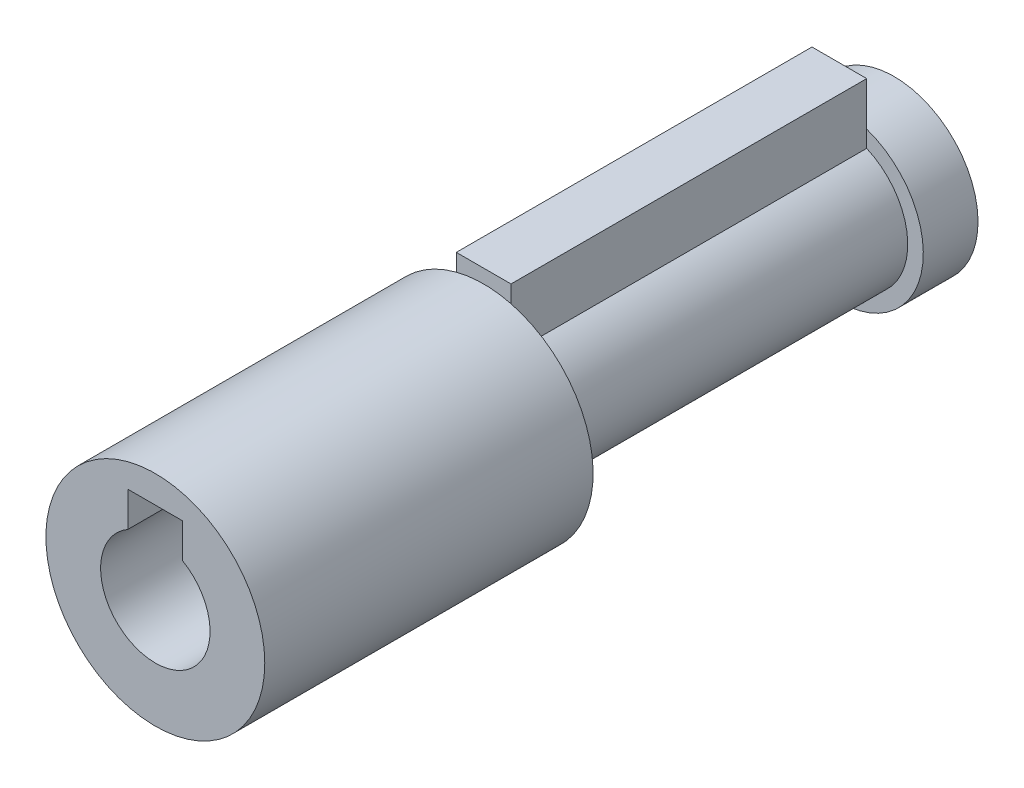
ISO-10303-21;
HEADER;
FILE_DESCRIPTION(('STEP AP214'),'2;1');
FILE_NAME('part.step','',(''),(''),'','','');
FILE_SCHEMA(('AUTOMOTIVE_DESIGN { 1 0 10303 214 1 1 1 1 }'));
ENDSEC;
DATA;
#1=APPLICATION_CONTEXT('core data for automotive mechanical design processes');
#2=APPLICATION_PROTOCOL_DEFINITION('international standard','automotive_design',2000,#1);
#3=PRODUCT_CONTEXT('',#1,'mechanical');
#4=PRODUCT('Part','Part','',(#3));
#5=PRODUCT_RELATED_PRODUCT_CATEGORY('part','',(#4));
#6=PRODUCT_DEFINITION_FORMATION('','',#4);
#7=PRODUCT_DEFINITION_CONTEXT('part definition',#1,'design');
#8=PRODUCT_DEFINITION('design','',#6,#7);
#9=PRODUCT_DEFINITION_SHAPE('','',#8);
#10=(LENGTH_UNIT() NAMED_UNIT(*) SI_UNIT(.MILLI.,.METRE.));
#11=(NAMED_UNIT(*) PLANE_ANGLE_UNIT() SI_UNIT($,.RADIAN.));
#12=(NAMED_UNIT(*) SI_UNIT($,.STERADIAN.) SOLID_ANGLE_UNIT());
#13=UNCERTAINTY_MEASURE_WITH_UNIT(LENGTH_MEASURE(1.E-05),#10,'distance_accuracy_value','');
#14=(GEOMETRIC_REPRESENTATION_CONTEXT(3) GLOBAL_UNCERTAINTY_ASSIGNED_CONTEXT((#13)) GLOBAL_UNIT_ASSIGNED_CONTEXT((#10,
#11,#12)) REPRESENTATION_CONTEXT('',''));
#15=CARTESIAN_POINT('',(0.,0.,0.));
#16=DIRECTION('',(0.,0.,1.));
#17=DIRECTION('',(1.,0.,0.));
#18=AXIS2_PLACEMENT_3D('',#15,#16,#17);
#19=CARTESIAN_POINT('',(0.,0.,12.7));
#20=DIRECTION('',(0.,0.,-1.));
#21=DIRECTION('',(-1.,0.,0.));
#22=AXIS2_PLACEMENT_3D('',#19,#20,#21);
#23=CYLINDRICAL_SURFACE('',#22,2.54);
#24=CARTESIAN_POINT('',(0.,0.,0.));
#25=DIRECTION('',(0.,0.,1.));
#26=DIRECTION('',(1.,0.,0.));
#27=AXIS2_PLACEMENT_3D('',#24,#25,#26);
#28=CIRCLE('',#27,2.54);
#29=CARTESIAN_POINT('',(-1.27,2.19970452561247,0.));
#30=VERTEX_POINT('',#29);
#31=CARTESIAN_POINT('',(1.27,2.19970452561247,0.));
#32=VERTEX_POINT('',#31);
#33=EDGE_CURVE('E176',#30,#32,#28,.T.);
#34=ORIENTED_EDGE('',*,*,#33,.F.);
#35=DIRECTION('',(0.,0.,-1.));
#36=VECTOR('',#35,1.);
#37=CARTESIAN_POINT('',(-1.27,2.19970452561247,12.7));
#38=LINE('',#37,#36);
#39=CARTESIAN_POINT('',(-1.27,2.19970452561247,12.7));
#40=VERTEX_POINT('',#39);
#41=EDGE_CURVE('E47',#40,#30,#38,.T.);
#42=ORIENTED_EDGE('',*,*,#41,.F.);
#43=CARTESIAN_POINT('',(0.,0.,12.7));
#44=DIRECTION('',(0.,0.,1.));
#45=DIRECTION('',(1.,0.,0.));
#46=AXIS2_PLACEMENT_3D('',#43,#44,#45);
#47=CIRCLE('',#46,2.54);
#48=CARTESIAN_POINT('',(1.27,2.19970452561247,12.7));
#49=VERTEX_POINT('',#48);
#50=EDGE_CURVE('E177',#40,#49,#47,.T.);
#51=ORIENTED_EDGE('',*,*,#50,.T.);
#52=DIRECTION('',(0.,0.,-1.));
#53=VECTOR('',#52,1.);
#54=CARTESIAN_POINT('',(1.27,2.19970452561247,12.7));
#55=LINE('',#54,#53);
#56=EDGE_CURVE('E191',#49,#32,#55,.T.);
#57=ORIENTED_EDGE('',*,*,#56,.T.);
#58=EDGE_LOOP('',(#34,#42,#51,#57));
#59=FACE_BOUND('',#58,.T.);
#60=ADVANCED_FACE('F44',(#59),#23,.F.);
#61=CARTESIAN_POINT('',(-1.27,0.,12.7));
#62=DIRECTION('',(1.,0.,0.));
#63=DIRECTION('',(0.,0.,-1.));
#64=AXIS2_PLACEMENT_3D('',#61,#62,#63);
#65=PLANE('',#64);
#66=DIRECTION('',(0.,-1.,0.));
#67=VECTOR('',#66,1.);
#68=CARTESIAN_POINT('',(-1.27,0.,0.));
#69=LINE('',#68,#67);
#70=CARTESIAN_POINT('',(-1.27,3.81,0.));
#71=VERTEX_POINT('',#70);
#72=EDGE_CURVE('E194',#71,#30,#69,.T.);
#73=ORIENTED_EDGE('',*,*,#72,.F.);
#74=DIRECTION('',(0.,0.,-1.));
#75=VECTOR('',#74,1.);
#76=CARTESIAN_POINT('',(-1.27,3.81,12.7));
#77=LINE('',#76,#75);
#78=CARTESIAN_POINT('',(-1.27,3.81,12.7));
#79=VERTEX_POINT('',#78);
#80=EDGE_CURVE('E204',#79,#71,#77,.T.);
#81=ORIENTED_EDGE('',*,*,#80,.F.);
#82=DIRECTION('',(0.,-1.,0.));
#83=VECTOR('',#82,1.);
#84=CARTESIAN_POINT('',(-1.27,0.,12.7));
#85=LINE('',#84,#83);
#86=EDGE_CURVE('E180',#79,#40,#85,.T.);
#87=ORIENTED_EDGE('',*,*,#86,.T.);
#88=ORIENTED_EDGE('',*,*,#41,.T.);
#89=EDGE_LOOP('',(#73,#81,#87,#88));
#90=FACE_BOUND('',#89,.T.);
#91=ADVANCED_FACE('F210',(#90),#65,.T.);
#92=CARTESIAN_POINT('',(0.,3.81,12.7));
#93=DIRECTION('',(0.,1.,0.));
#94=DIRECTION('',(-1.,0.,0.));
#95=AXIS2_PLACEMENT_3D('',#92,#93,#94);
#96=PLANE('',#95);
#97=DIRECTION('',(1.,0.,0.));
#98=VECTOR('',#97,1.);
#99=CARTESIAN_POINT('',(0.,3.81,0.));
#100=LINE('',#99,#98);
#101=CARTESIAN_POINT('',(1.27,3.81,0.));
#102=VERTEX_POINT('',#101);
#103=EDGE_CURVE('E197',#71,#102,#100,.T.);
#104=ORIENTED_EDGE('',*,*,#103,.T.);
#105=DIRECTION('',(0.,0.,-1.));
#106=VECTOR('',#105,1.);
#107=CARTESIAN_POINT('',(1.27,3.81,12.7));
#108=LINE('',#107,#106);
#109=CARTESIAN_POINT('',(1.27,3.81,12.7));
#110=VERTEX_POINT('',#109);
#111=EDGE_CURVE('E202',#110,#102,#108,.T.);
#112=ORIENTED_EDGE('',*,*,#111,.F.);
#113=DIRECTION('',(1.,0.,0.));
#114=VECTOR('',#113,1.);
#115=CARTESIAN_POINT('',(0.,3.81,12.7));
#116=LINE('',#115,#114);
#117=EDGE_CURVE('E184',#79,#110,#116,.T.);
#118=ORIENTED_EDGE('',*,*,#117,.F.);
#119=ORIENTED_EDGE('',*,*,#80,.T.);
#120=EDGE_LOOP('',(#104,#112,#118,#119));
#121=FACE_BOUND('',#120,.T.);
#122=ADVANCED_FACE('F219',(#121),#96,.F.);
#123=CARTESIAN_POINT('',(1.27,0.,12.7));
#124=DIRECTION('',(1.,0.,0.));
#125=DIRECTION('',(0.,1.,0.));
#126=AXIS2_PLACEMENT_3D('',#123,#124,#125);
#127=PLANE('',#126);
#128=DIRECTION('',(0.,-1.,0.));
#129=VECTOR('',#128,1.);
#130=CARTESIAN_POINT('',(1.27,0.,0.));
#131=LINE('',#130,#129);
#132=EDGE_CURVE('E181',#102,#32,#131,.T.);
#133=ORIENTED_EDGE('',*,*,#132,.T.);
#134=ORIENTED_EDGE('',*,*,#56,.F.);
#135=DIRECTION('',(0.,-1.,0.));
#136=VECTOR('',#135,1.);
#137=CARTESIAN_POINT('',(1.27,0.,12.7));
#138=LINE('',#137,#136);
#139=EDGE_CURVE('E186',#110,#49,#138,.T.);
#140=ORIENTED_EDGE('',*,*,#139,.F.);
#141=ORIENTED_EDGE('',*,*,#111,.T.);
#142=EDGE_LOOP('',(#133,#134,#140,#141));
#143=FACE_BOUND('',#142,.T.);
#144=ADVANCED_FACE('F222',(#143),#127,.F.);
#145=CARTESIAN_POINT('',(0.,0.,12.7));
#146=DIRECTION('',(0.,0.,-1.));
#147=DIRECTION('',(-1.,0.,0.));
#148=AXIS2_PLACEMENT_3D('',#145,#146,#147);
#149=CYLINDRICAL_SURFACE('',#148,5.08);
#150=CARTESIAN_POINT('',(0.,0.,12.7));
#151=DIRECTION('',(0.,0.,1.));
#152=DIRECTION('',(1.,0.,0.));
#153=AXIS2_PLACEMENT_3D('',#150,#151,#152);
#154=CIRCLE('',#153,5.08);
#155=CARTESIAN_POINT('',(5.08,0.,12.7));
#156=VERTEX_POINT('',#155);
#157=EDGE_CURVE('E188',#156,#156,#154,.T.);
#158=ORIENTED_EDGE('',*,*,#157,.F.);
#159=EDGE_LOOP('',(#158));
#160=FACE_BOUND('',#159,.T.);
#161=CARTESIAN_POINT('',(0.,0.,-2.54));
#162=DIRECTION('',(0.,0.,-1.));
#163=DIRECTION('',(-1.,0.,0.));
#164=AXIS2_PLACEMENT_3D('',#161,#162,#163);
#165=CIRCLE('',#164,5.08);
#166=CARTESIAN_POINT('',(-1.27,4.91868884968342,-2.54));
#167=VERTEX_POINT('',#166);
#168=CARTESIAN_POINT('',(1.27,4.91868884968342,-2.54));
#169=VERTEX_POINT('',#168);
#170=EDGE_CURVE('E173',#167,#169,#165,.T.);
#171=ORIENTED_EDGE('',*,*,#170,.F.);
#172=EDGE_CURVE('E172',#169,#167,#165,.T.);
#173=ORIENTED_EDGE('',*,*,#172,.F.);
#174=EDGE_LOOP('',(#171,#173));
#175=FACE_BOUND('',#174,.T.);
#176=ADVANCED_FACE('F239',(#160,#175),#149,.T.);
#177=CARTESIAN_POINT('',(0.,0.,12.7));
#178=DIRECTION('',(0.,0.,1.));
#179=DIRECTION('',(1.,0.,0.));
#180=AXIS2_PLACEMENT_3D('',#177,#178,#179);
#181=PLANE('',#180);
#182=ORIENTED_EDGE('',*,*,#50,.F.);
#183=ORIENTED_EDGE('',*,*,#86,.F.);
#184=ORIENTED_EDGE('',*,*,#117,.T.);
#185=ORIENTED_EDGE('',*,*,#139,.T.);
#186=EDGE_LOOP('',(#182,#183,#184,#185));
#187=FACE_BOUND('',#186,.T.);
#188=ORIENTED_EDGE('',*,*,#157,.T.);
#189=EDGE_LOOP('',(#188));
#190=FACE_BOUND('',#189,.T.);
#191=ADVANCED_FACE('F225',(#187,#190),#181,.T.);
#192=CARTESIAN_POINT('',(0.,0.,0.));
#193=DIRECTION('',(0.,0.,-1.));
#194=DIRECTION('',(-1.,0.,0.));
#195=AXIS2_PLACEMENT_3D('',#192,#193,#194);
#196=PLANE('',#195);
#197=ORIENTED_EDGE('',*,*,#72,.T.);
#198=ORIENTED_EDGE('',*,*,#33,.T.);
#199=ORIENTED_EDGE('',*,*,#132,.F.);
#200=ORIENTED_EDGE('',*,*,#103,.F.);
#201=EDGE_LOOP('',(#197,#198,#199,#200));
#202=FACE_BOUND('',#201,.T.);
#203=ADVANCED_FACE('F216',(#202),#196,.F.);
#204=CARTESIAN_POINT('',(0.,0.,-2.54));
#205=DIRECTION('',(0.,0.,-1.));
#206=DIRECTION('',(-1.,0.,0.));
#207=AXIS2_PLACEMENT_3D('',#204,#205,#206);
#208=PLANE('',#207);
#209=DIRECTION('',(0.,-1.,0.));
#210=VECTOR('',#209,1.);
#211=CARTESIAN_POINT('',(1.27,5.715,-2.54));
#212=LINE('',#211,#210);
#213=CARTESIAN_POINT('',(1.27,2.90993556629696,-2.54));
#214=VERTEX_POINT('',#213);
#215=EDGE_CURVE('E11',#169,#214,#212,.T.);
#216=ORIENTED_EDGE('',*,*,#215,.F.);
#217=ORIENTED_EDGE('',*,*,#172,.T.);
#218=DIRECTION('',(0.,1.,0.));
#219=VECTOR('',#218,1.);
#220=CARTESIAN_POINT('',(-1.27,5.715,-2.54));
#221=LINE('',#220,#219);
#222=CARTESIAN_POINT('',(-1.27,2.90993556629696,-2.54));
#223=VERTEX_POINT('',#222);
#224=EDGE_CURVE('E160',#223,#167,#221,.T.);
#225=ORIENTED_EDGE('',*,*,#224,.F.);
#226=CARTESIAN_POINT('',(0.,0.,-2.54));
#227=DIRECTION('',(0.,0.,-1.));
#228=DIRECTION('',(-1.,0.,0.));
#229=AXIS2_PLACEMENT_3D('',#226,#227,#228);
#230=CIRCLE('',#229,3.175);
#231=EDGE_CURVE('E68',#214,#223,#230,.T.);
#232=ORIENTED_EDGE('',*,*,#231,.F.);
#233=EDGE_LOOP('',(#216,#217,#225,#232));
#234=FACE_BOUND('',#233,.T.);
#235=ADVANCED_FACE('F246',(#234),#208,.T.);
#236=CARTESIAN_POINT('',(0.,0.,-2.54));
#237=DIRECTION('',(0.,0.,-1.));
#238=DIRECTION('',(-1.,0.,0.));
#239=AXIS2_PLACEMENT_3D('',#236,#237,#238);
#240=PLANE('',#239);
#241=CARTESIAN_POINT('',(-1.27,5.715,-2.54));
#242=VERTEX_POINT('',#241);
#243=EDGE_CURVE('E159',#167,#242,#221,.T.);
#244=ORIENTED_EDGE('',*,*,#243,.F.);
#245=ORIENTED_EDGE('',*,*,#170,.T.);
#246=CARTESIAN_POINT('',(1.27,5.715,-2.54));
#247=VERTEX_POINT('',#246);
#248=EDGE_CURVE('E53',#247,#169,#212,.T.);
#249=ORIENTED_EDGE('',*,*,#248,.F.);
#250=DIRECTION('',(1.,0.,0.));
#251=VECTOR('',#250,1.);
#252=CARTESIAN_POINT('',(1.27,5.715,-2.54));
#253=LINE('',#252,#251);
#254=EDGE_CURVE('E139',#242,#247,#253,.T.);
#255=ORIENTED_EDGE('',*,*,#254,.F.);
#256=EDGE_LOOP('',(#244,#245,#249,#255));
#257=FACE_BOUND('',#256,.T.);
#258=ADVANCED_FACE('F249',(#257),#240,.F.);
#259=CARTESIAN_POINT('',(1.27,5.715,-19.05));
#260=DIRECTION('',(-1.,0.,0.));
#261=DIRECTION('',(0.,-1.,0.));
#262=AXIS2_PLACEMENT_3D('',#259,#260,#261);
#263=PLANE('',#262);
#264=ORIENTED_EDGE('',*,*,#248,.T.);
#265=ORIENTED_EDGE('',*,*,#215,.T.);
#266=DIRECTION('',(0.,0.,1.));
#267=VECTOR('',#266,1.);
#268=CARTESIAN_POINT('',(1.27,2.90993556629696,-19.05));
#269=LINE('',#268,#267);
#270=CARTESIAN_POINT('',(1.27,2.90993556629696,-19.05));
#271=VERTEX_POINT('',#270);
#272=EDGE_CURVE('E136',#271,#214,#269,.T.);
#273=ORIENTED_EDGE('',*,*,#272,.F.);
#274=DIRECTION('',(0.,-1.,0.));
#275=VECTOR('',#274,1.);
#276=CARTESIAN_POINT('',(1.27,5.715,-19.05));
#277=LINE('',#276,#275);
#278=CARTESIAN_POINT('',(1.27,3.68440227894967,-19.05));
#279=VERTEX_POINT('',#278);
#280=EDGE_CURVE('E128',#279,#271,#277,.T.);
#281=ORIENTED_EDGE('',*,*,#280,.F.);
#282=CARTESIAN_POINT('',(1.27,5.715,-19.05));
#283=VERTEX_POINT('',#282);
#284=EDGE_CURVE('E119',#283,#279,#277,.T.);
#285=ORIENTED_EDGE('',*,*,#284,.F.);
#286=DIRECTION('',(0.,0.,1.));
#287=VECTOR('',#286,1.);
#288=CARTESIAN_POINT('',(1.27,5.715,-19.05));
#289=LINE('',#288,#287);
#290=EDGE_CURVE('E156',#283,#247,#289,.T.);
#291=ORIENTED_EDGE('',*,*,#290,.T.);
#292=EDGE_LOOP('',(#264,#265,#273,#281,#285,#291));
#293=FACE_BOUND('',#292,.T.);
#294=ADVANCED_FACE('F134',(#293),#263,.F.);
#295=CARTESIAN_POINT('',(0.,0.,-19.05));
#296=DIRECTION('',(0.,0.,1.));
#297=DIRECTION('',(1.,0.,0.));
#298=AXIS2_PLACEMENT_3D('',#295,#296,#297);
#299=CYLINDRICAL_SURFACE('',#298,3.175);
#300=ORIENTED_EDGE('',*,*,#231,.T.);
#301=DIRECTION('',(0.,0.,1.));
#302=VECTOR('',#301,1.);
#303=CARTESIAN_POINT('',(-1.27,2.90993556629696,-19.05));
#304=LINE('',#303,#302);
#305=CARTESIAN_POINT('',(-1.27,2.90993556629696,-19.05));
#306=VERTEX_POINT('',#305);
#307=EDGE_CURVE('E168',#306,#223,#304,.T.);
#308=ORIENTED_EDGE('',*,*,#307,.F.);
#309=CARTESIAN_POINT('',(0.,0.,-19.05));
#310=DIRECTION('',(0.,0.,-1.));
#311=DIRECTION('',(-1.,0.,0.));
#312=AXIS2_PLACEMENT_3D('',#309,#310,#311);
#313=CIRCLE('',#312,3.175);
#314=EDGE_CURVE('E127',#271,#306,#313,.T.);
#315=ORIENTED_EDGE('',*,*,#314,.F.);
#316=ORIENTED_EDGE('',*,*,#272,.T.);
#317=EDGE_LOOP('',(#300,#308,#315,#316));
#318=FACE_BOUND('',#317,.T.);
#319=ADVANCED_FACE('F252',(#318),#299,.T.);
#320=CARTESIAN_POINT('',(-1.27,5.715,-19.05));
#321=DIRECTION('',(1.,0.,0.));
#322=DIRECTION('',(0.,1.,0.));
#323=AXIS2_PLACEMENT_3D('',#320,#321,#322);
#324=PLANE('',#323);
#325=ORIENTED_EDGE('',*,*,#224,.T.);
#326=ORIENTED_EDGE('',*,*,#243,.T.);
#327=DIRECTION('',(0.,0.,1.));
#328=VECTOR('',#327,1.);
#329=CARTESIAN_POINT('',(-1.27,5.715,-19.05));
#330=LINE('',#329,#328);
#331=CARTESIAN_POINT('',(-1.27,5.715,-19.05));
#332=VERTEX_POINT('',#331);
#333=EDGE_CURVE('E165',#332,#242,#330,.T.);
#334=ORIENTED_EDGE('',*,*,#333,.F.);
#335=DIRECTION('',(0.,1.,0.));
#336=VECTOR('',#335,1.);
#337=CARTESIAN_POINT('',(-1.27,5.715,-19.05));
#338=LINE('',#337,#336);
#339=CARTESIAN_POINT('',(-1.27,3.68440227894967,-19.05));
#340=VERTEX_POINT('',#339);
#341=EDGE_CURVE('E154',#340,#332,#338,.T.);
#342=ORIENTED_EDGE('',*,*,#341,.F.);
#343=EDGE_CURVE('E145',#306,#340,#338,.T.);
#344=ORIENTED_EDGE('',*,*,#343,.F.);
#345=ORIENTED_EDGE('',*,*,#307,.T.);
#346=EDGE_LOOP('',(#325,#326,#334,#342,#344,#345));
#347=FACE_BOUND('',#346,.T.);
#348=ADVANCED_FACE('F255',(#347),#324,.F.);
#349=CARTESIAN_POINT('',(1.27,5.715,-19.05));
#350=DIRECTION('',(0.,-1.,0.));
#351=DIRECTION('',(0.,0.,-1.));
#352=AXIS2_PLACEMENT_3D('',#349,#350,#351);
#353=PLANE('',#352);
#354=ORIENTED_EDGE('',*,*,#254,.T.);
#355=ORIENTED_EDGE('',*,*,#290,.F.);
#356=DIRECTION('',(1.,0.,0.));
#357=VECTOR('',#356,1.);
#358=CARTESIAN_POINT('',(1.27,5.715,-19.05));
#359=LINE('',#358,#357);
#360=EDGE_CURVE('E123',#332,#283,#359,.T.);
#361=ORIENTED_EDGE('',*,*,#360,.F.);
#362=ORIENTED_EDGE('',*,*,#333,.T.);
#363=EDGE_LOOP('',(#354,#355,#361,#362));
#364=FACE_BOUND('',#363,.T.);
#365=ADVANCED_FACE('F259',(#364),#353,.F.);
#366=CARTESIAN_POINT('',(0.,0.,-19.05));
#367=DIRECTION('',(0.,0.,-1.));
#368=DIRECTION('',(-1.,0.,0.));
#369=AXIS2_PLACEMENT_3D('',#366,#367,#368);
#370=PLANE('',#369);
#371=CARTESIAN_POINT('',(0.,0.,-19.05));
#372=DIRECTION('',(0.,0.,-1.));
#373=DIRECTION('',(-1.,0.,0.));
#374=AXIS2_PLACEMENT_3D('',#371,#372,#373);
#375=CIRCLE('',#374,3.8971425625873);
#376=EDGE_CURVE('E60',#340,#279,#375,.T.);
#377=ORIENTED_EDGE('',*,*,#376,.F.);
#378=ORIENTED_EDGE('',*,*,#341,.T.);
#379=ORIENTED_EDGE('',*,*,#360,.T.);
#380=ORIENTED_EDGE('',*,*,#284,.T.);
#381=EDGE_LOOP('',(#377,#378,#379,#380));
#382=FACE_BOUND('',#381,.T.);
#383=ADVANCED_FACE('F121',(#382),#370,.T.);
#384=CARTESIAN_POINT('',(0.,0.,-19.05));
#385=DIRECTION('',(0.,0.,-1.));
#386=DIRECTION('',(-1.,0.,0.));
#387=AXIS2_PLACEMENT_3D('',#384,#385,#386);
#388=PLANE('',#387);
#389=EDGE_CURVE('E142',#279,#340,#375,.T.);
#390=ORIENTED_EDGE('',*,*,#389,.F.);
#391=ORIENTED_EDGE('',*,*,#280,.T.);
#392=ORIENTED_EDGE('',*,*,#314,.T.);
#393=ORIENTED_EDGE('',*,*,#343,.T.);
#394=EDGE_LOOP('',(#390,#391,#392,#393));
#395=FACE_BOUND('',#394,.T.);
#396=ADVANCED_FACE('F143',(#395),#388,.F.);
#397=CARTESIAN_POINT('',(0.,0.,-21.59));
#398=DIRECTION('',(0.,0.,1.));
#399=DIRECTION('',(1.,0.,0.));
#400=AXIS2_PLACEMENT_3D('',#397,#398,#399);
#401=CYLINDRICAL_SURFACE('',#400,3.8971425625873);
#402=CARTESIAN_POINT('',(0.,0.,-21.59));
#403=DIRECTION('',(0.,0.,-1.));
#404=DIRECTION('',(-1.,0.,0.));
#405=AXIS2_PLACEMENT_3D('',#402,#403,#404);
#406=CIRCLE('',#405,3.8971425625873);
#407=CARTESIAN_POINT('',(-3.8971425625873,0.,-21.59));
#408=VERTEX_POINT('',#407);
#409=EDGE_CURVE('E149',#408,#408,#406,.T.);
#410=ORIENTED_EDGE('',*,*,#409,.F.);
#411=EDGE_LOOP('',(#410));
#412=FACE_BOUND('',#411,.T.);
#413=ORIENTED_EDGE('',*,*,#376,.T.);
#414=ORIENTED_EDGE('',*,*,#389,.T.);
#415=EDGE_LOOP('',(#413,#414));
#416=FACE_BOUND('',#415,.T.);
#417=ADVANCED_FACE('F148',(#412,#416),#401,.T.);
#418=CARTESIAN_POINT('',(0.,0.,-21.59));
#419=DIRECTION('',(0.,0.,-1.));
#420=DIRECTION('',(-1.,0.,0.));
#421=AXIS2_PLACEMENT_3D('',#418,#419,#420);
#422=PLANE('',#421);
#423=ORIENTED_EDGE('',*,*,#409,.T.);
#424=EDGE_LOOP('',(#423));
#425=FACE_BOUND('',#424,.T.);
#426=ADVANCED_FACE('F271',(#425),#422,.T.);
#427=CLOSED_SHELL('',(#60,#91,#122,#144,#176,#191,#203,#235,#258,#294,#319,#348,#365,#383,#396,
#417,#426));
#428=MANIFOLD_SOLID_BREP('B2',#427);
#429=ADVANCED_BREP_SHAPE_REPRESENTATION('',(#18,#428),#14);
#430=SHAPE_DEFINITION_REPRESENTATION(#9,#429);
ENDSEC;
END-ISO-10303-21;
